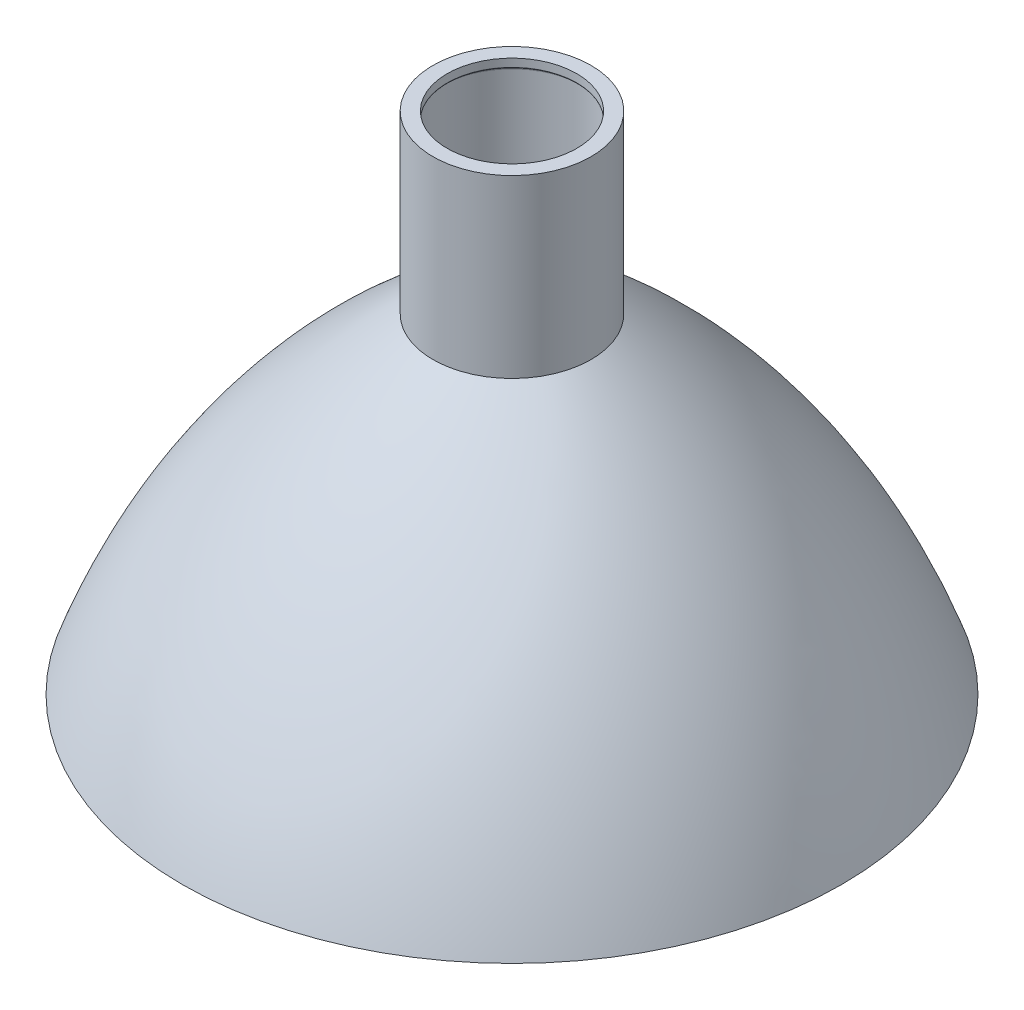
ISO-10303-21;
HEADER;
FILE_DESCRIPTION(('STEP AP214'),'2;1');
FILE_NAME('part.step','',(''),(''),'','','');
FILE_SCHEMA(('AUTOMOTIVE_DESIGN { 1 0 10303 214 1 1 1 1 }'));
ENDSEC;
DATA;
#1=APPLICATION_CONTEXT('core data for automotive mechanical design processes');
#2=APPLICATION_PROTOCOL_DEFINITION('international standard','automotive_design',2000,#1);
#3=PRODUCT_CONTEXT('',#1,'mechanical');
#4=PRODUCT('Part','Part','',(#3));
#5=PRODUCT_RELATED_PRODUCT_CATEGORY('part','',(#4));
#6=PRODUCT_DEFINITION_FORMATION('','',#4);
#7=PRODUCT_DEFINITION_CONTEXT('part definition',#1,'design');
#8=PRODUCT_DEFINITION('design','',#6,#7);
#9=PRODUCT_DEFINITION_SHAPE('','',#8);
#10=(LENGTH_UNIT() NAMED_UNIT(*) SI_UNIT(.MILLI.,.METRE.));
#11=(NAMED_UNIT(*) PLANE_ANGLE_UNIT() SI_UNIT($,.RADIAN.));
#12=(NAMED_UNIT(*) SI_UNIT($,.STERADIAN.) SOLID_ANGLE_UNIT());
#13=UNCERTAINTY_MEASURE_WITH_UNIT(LENGTH_MEASURE(1.E-05),#10,'distance_accuracy_value','');
#14=(GEOMETRIC_REPRESENTATION_CONTEXT(3) GLOBAL_UNCERTAINTY_ASSIGNED_CONTEXT((#13)) GLOBAL_UNIT_ASSIGNED_CONTEXT((#10,
#11,#12)) REPRESENTATION_CONTEXT('',''));
#15=CARTESIAN_POINT('',(0.,0.,0.));
#16=DIRECTION('',(0.,0.,1.));
#17=DIRECTION('',(1.,0.,0.));
#18=AXIS2_PLACEMENT_3D('',#15,#16,#17);
#19=CARTESIAN_POINT('',(0.,0.,0.));
#20=DIRECTION('',(0.,1.,0.));
#21=DIRECTION('',(0.,0.,1.));
#22=AXIS2_PLACEMENT_3D('',#19,#20,#21);
#23=PLANE('',#22);
#24=CARTESIAN_POINT('',(0.,0.,0.));
#25=DIRECTION('',(0.,-1.,0.));
#26=DIRECTION('',(0.,0.,-1.));
#27=AXIS2_PLACEMENT_3D('',#24,#25,#26);
#28=CIRCLE('',#27,73.);
#29=CARTESIAN_POINT('',(0.,0.,-73.));
#30=VERTEX_POINT('',#29);
#31=EDGE_CURVE('E12',#30,#30,#28,.T.);
#32=ORIENTED_EDGE('',*,*,#31,.F.);
#33=EDGE_LOOP('',(#32));
#34=FACE_BOUND('',#33,.T.);
#35=CARTESIAN_POINT('',(0.,0.,0.));
#36=DIRECTION('',(0.,-1.,0.));
#37=DIRECTION('',(0.,0.,-1.));
#38=AXIS2_PLACEMENT_3D('',#35,#36,#37);
#39=CIRCLE('',#38,75.);
#40=CARTESIAN_POINT('',(0.,0.,-75.));
#41=VERTEX_POINT('',#40);
#42=EDGE_CURVE('E78',#41,#41,#39,.T.);
#43=ORIENTED_EDGE('',*,*,#42,.T.);
#44=EDGE_LOOP('',(#43));
#45=FACE_BOUND('',#44,.T.);
#46=ADVANCED_FACE('F44',(#34,#45),#23,.F.);
#47=CARTESIAN_POINT('',(-73.,0.,0.));
#48=CARTESIAN_POINT('',(-55.2039682408838,45.6045932493017,0.));
#49=CARTESIAN_POINT('',(-16.,74.9999999999999,0.));
#50=B_SPLINE_CURVE_WITH_KNOTS('',2,(#47,#48,#49),.UNSPECIFIED.,.F.,.F.,(3,3),(0.,1.),.UNSPECIFIED.);
#51=CARTESIAN_POINT('',(0.,0.,0.));
#52=DIRECTION('',(0.,-1.,0.));
#53=AXIS1_PLACEMENT('',#51,#52);
#54=SURFACE_OF_REVOLUTION('',#50,#53);
#55=CARTESIAN_POINT('',(0.,75.,0.));
#56=DIRECTION('',(0.,-1.,0.));
#57=DIRECTION('',(0.,0.,-1.));
#58=AXIS2_PLACEMENT_3D('',#55,#56,#57);
#59=CIRCLE('',#58,16.);
#60=CARTESIAN_POINT('',(0.,75.,-16.));
#61=VERTEX_POINT('',#60);
#62=EDGE_CURVE('E50',#61,#61,#59,.T.);
#63=ORIENTED_EDGE('',*,*,#62,.F.);
#64=EDGE_LOOP('',(#63));
#65=FACE_BOUND('',#64,.T.);
#66=ORIENTED_EDGE('',*,*,#31,.T.);
#67=EDGE_LOOP('',(#66));
#68=FACE_BOUND('',#67,.T.);
#69=ADVANCED_FACE('F122',(#65,#68),#54,.T.);
#70=CARTESIAN_POINT('',(0.,0.,0.));
#71=DIRECTION('',(0.,-1.,0.));
#72=DIRECTION('',(0.,0.,-1.));
#73=AXIS2_PLACEMENT_3D('',#70,#71,#72);
#74=CYLINDRICAL_SURFACE('',#73,16.);
#75=CARTESIAN_POINT('',(0.,112.,0.));
#76=DIRECTION('',(0.,-1.,0.));
#77=DIRECTION('',(0.,0.,-1.));
#78=AXIS2_PLACEMENT_3D('',#75,#76,#77);
#79=CIRCLE('',#78,16.);
#80=CARTESIAN_POINT('',(0.,112.,-16.0000000000001));
#81=VERTEX_POINT('',#80);
#82=EDGE_CURVE('E54',#81,#81,#79,.T.);
#83=ORIENTED_EDGE('',*,*,#82,.F.);
#84=EDGE_LOOP('',(#83));
#85=FACE_BOUND('',#84,.T.);
#86=ORIENTED_EDGE('',*,*,#62,.T.);
#87=EDGE_LOOP('',(#86));
#88=FACE_BOUND('',#87,.T.);
#89=ADVANCED_FACE('F119',(#85,#88),#74,.F.);
#90=CARTESIAN_POINT('',(0.,112.,0.));
#91=DIRECTION('',(0.,-1.,0.));
#92=DIRECTION('',(0.,0.,-1.));
#93=AXIS2_PLACEMENT_3D('',#90,#91,#92);
#94=TOROIDAL_SURFACE('',#93,15.,1.);
#95=ORIENTED_EDGE('',*,*,#82,.T.);
#96=EDGE_LOOP('',(#95));
#97=FACE_BOUND('',#96,.T.);
#98=CARTESIAN_POINT('',(0.,113.,0.));
#99=DIRECTION('',(0.,-1.,0.));
#100=DIRECTION('',(0.,0.,-1.));
#101=AXIS2_PLACEMENT_3D('',#98,#99,#100);
#102=CIRCLE('',#101,15.);
#103=CARTESIAN_POINT('',(0.,113.,-15.));
#104=VERTEX_POINT('',#103);
#105=EDGE_CURVE('E58',#104,#104,#102,.T.);
#106=ORIENTED_EDGE('',*,*,#105,.F.);
#107=EDGE_LOOP('',(#106));
#108=FACE_BOUND('',#107,.T.);
#109=ADVANCED_FACE('F115',(#97,#108),#94,.F.);
#110=CARTESIAN_POINT('',(0.,113.,0.));
#111=DIRECTION('',(0.,-1.,0.));
#112=DIRECTION('',(0.,0.,-1.));
#113=AXIS2_PLACEMENT_3D('',#110,#111,#112);
#114=PLANE('',#113);
#115=ORIENTED_EDGE('',*,*,#105,.T.);
#116=EDGE_LOOP('',(#115));
#117=FACE_BOUND('',#116,.T.);
#118=CARTESIAN_POINT('',(0.,113.,0.));
#119=DIRECTION('',(0.,-1.,0.));
#120=DIRECTION('',(0.,0.,-1.));
#121=AXIS2_PLACEMENT_3D('',#118,#119,#120);
#122=CIRCLE('',#121,14.95);
#123=CARTESIAN_POINT('',(0.,113.,-14.95));
#124=VERTEX_POINT('',#123);
#125=EDGE_CURVE('E63',#124,#124,#122,.T.);
#126=ORIENTED_EDGE('',*,*,#125,.F.);
#127=EDGE_LOOP('',(#126));
#128=FACE_BOUND('',#127,.T.);
#129=ADVANCED_FACE('F111',(#117,#128),#114,.T.);
#130=CARTESIAN_POINT('',(0.,113.2,0.));
#131=DIRECTION('',(0.,-1.,0.));
#132=DIRECTION('',(0.,0.,-1.));
#133=AXIS2_PLACEMENT_3D('',#130,#131,#132);
#134=TOROIDAL_SURFACE('',#133,14.95,0.200000000000003);
#135=ORIENTED_EDGE('',*,*,#125,.T.);
#136=EDGE_LOOP('',(#135));
#137=FACE_BOUND('',#136,.T.);
#138=CARTESIAN_POINT('',(0.,113.2,0.));
#139=DIRECTION('',(0.,-1.,0.));
#140=DIRECTION('',(0.,0.,-1.));
#141=AXIS2_PLACEMENT_3D('',#138,#139,#140);
#142=CIRCLE('',#141,14.75);
#143=CARTESIAN_POINT('',(0.,113.2,-14.75));
#144=VERTEX_POINT('',#143);
#145=EDGE_CURVE('E66',#144,#144,#142,.T.);
#146=ORIENTED_EDGE('',*,*,#145,.F.);
#147=EDGE_LOOP('',(#146));
#148=FACE_BOUND('',#147,.T.);
#149=ADVANCED_FACE('F107',(#137,#148),#134,.T.);
#150=CARTESIAN_POINT('',(0.,0.,0.));
#151=DIRECTION('',(0.,-1.,0.));
#152=DIRECTION('',(0.,0.,-1.));
#153=AXIS2_PLACEMENT_3D('',#150,#151,#152);
#154=CYLINDRICAL_SURFACE('',#153,14.75);
#155=ORIENTED_EDGE('',*,*,#145,.T.);
#156=EDGE_LOOP('',(#155));
#157=FACE_BOUND('',#156,.T.);
#158=CARTESIAN_POINT('',(0.,115.,0.));
#159=DIRECTION('',(0.,-1.,0.));
#160=DIRECTION('',(0.,0.,-1.));
#161=AXIS2_PLACEMENT_3D('',#158,#159,#160);
#162=CIRCLE('',#161,14.75);
#163=CARTESIAN_POINT('',(0.,115.,-14.75));
#164=VERTEX_POINT('',#163);
#165=EDGE_CURVE('E69',#164,#164,#162,.T.);
#166=ORIENTED_EDGE('',*,*,#165,.F.);
#167=EDGE_LOOP('',(#166));
#168=FACE_BOUND('',#167,.T.);
#169=ADVANCED_FACE('F103',(#157,#168),#154,.F.);
#170=CARTESIAN_POINT('',(0.,115.,0.));
#171=DIRECTION('',(0.,1.,0.));
#172=DIRECTION('',(0.,0.,1.));
#173=AXIS2_PLACEMENT_3D('',#170,#171,#172);
#174=PLANE('',#173);
#175=ORIENTED_EDGE('',*,*,#165,.T.);
#176=EDGE_LOOP('',(#175));
#177=FACE_BOUND('',#176,.T.);
#178=CARTESIAN_POINT('',(0.,115.,0.));
#179=DIRECTION('',(0.,-1.,0.));
#180=DIRECTION('',(0.,0.,-1.));
#181=AXIS2_PLACEMENT_3D('',#178,#179,#180);
#182=CIRCLE('',#181,18.);
#183=CARTESIAN_POINT('',(0.,115.,-18.));
#184=VERTEX_POINT('',#183);
#185=EDGE_CURVE('E72',#184,#184,#182,.T.);
#186=ORIENTED_EDGE('',*,*,#185,.F.);
#187=EDGE_LOOP('',(#186));
#188=FACE_BOUND('',#187,.T.);
#189=ADVANCED_FACE('F99',(#177,#188),#174,.T.);
#190=CARTESIAN_POINT('',(0.,0.,0.));
#191=DIRECTION('',(0.,-1.,0.));
#192=DIRECTION('',(0.,0.,-1.));
#193=AXIS2_PLACEMENT_3D('',#190,#191,#192);
#194=CYLINDRICAL_SURFACE('',#193,18.);
#195=ORIENTED_EDGE('',*,*,#185,.T.);
#196=EDGE_LOOP('',(#195));
#197=FACE_BOUND('',#196,.T.);
#198=CARTESIAN_POINT('',(0.,75.,0.));
#199=DIRECTION('',(0.,-1.,0.));
#200=DIRECTION('',(0.,0.,-1.));
#201=AXIS2_PLACEMENT_3D('',#198,#199,#200);
#202=CIRCLE('',#201,18.);
#203=CARTESIAN_POINT('',(0.,75.,-18.));
#204=VERTEX_POINT('',#203);
#205=EDGE_CURVE('E75',#204,#204,#202,.T.);
#206=ORIENTED_EDGE('',*,*,#205,.F.);
#207=EDGE_LOOP('',(#206));
#208=FACE_BOUND('',#207,.T.);
#209=ADVANCED_FACE('F95',(#197,#208),#194,.T.);
#210=CARTESIAN_POINT('',(-75.,0.,0.));
#211=CARTESIAN_POINT('',(-58.4062741132546,46.5970360454982,0.));
#212=CARTESIAN_POINT('',(-18.,75.,0.));
#213=B_SPLINE_CURVE_WITH_KNOTS('',2,(#210,#211,#212),.UNSPECIFIED.,.F.,.F.,(3,3),(0.,1.),.UNSPECIFIED.);
#214=CARTESIAN_POINT('',(0.,0.,0.));
#215=DIRECTION('',(0.,-1.,0.));
#216=AXIS1_PLACEMENT('',#214,#215);
#217=SURFACE_OF_REVOLUTION('',#213,#216);
#218=ORIENTED_EDGE('',*,*,#205,.T.);
#219=EDGE_LOOP('',(#218));
#220=FACE_BOUND('',#219,.T.);
#221=ORIENTED_EDGE('',*,*,#42,.F.);
#222=EDGE_LOOP('',(#221));
#223=FACE_BOUND('',#222,.T.);
#224=ADVANCED_FACE('F92',(#220,#223),#217,.F.);
#225=CLOSED_SHELL('',(#46,#69,#89,#109,#129,#149,#169,#189,#209,#224));
#226=MANIFOLD_SOLID_BREP('B2',#225);
#227=ADVANCED_BREP_SHAPE_REPRESENTATION('',(#18,#226),#14);
#228=SHAPE_DEFINITION_REPRESENTATION(#9,#227);
ENDSEC;
END-ISO-10303-21;
